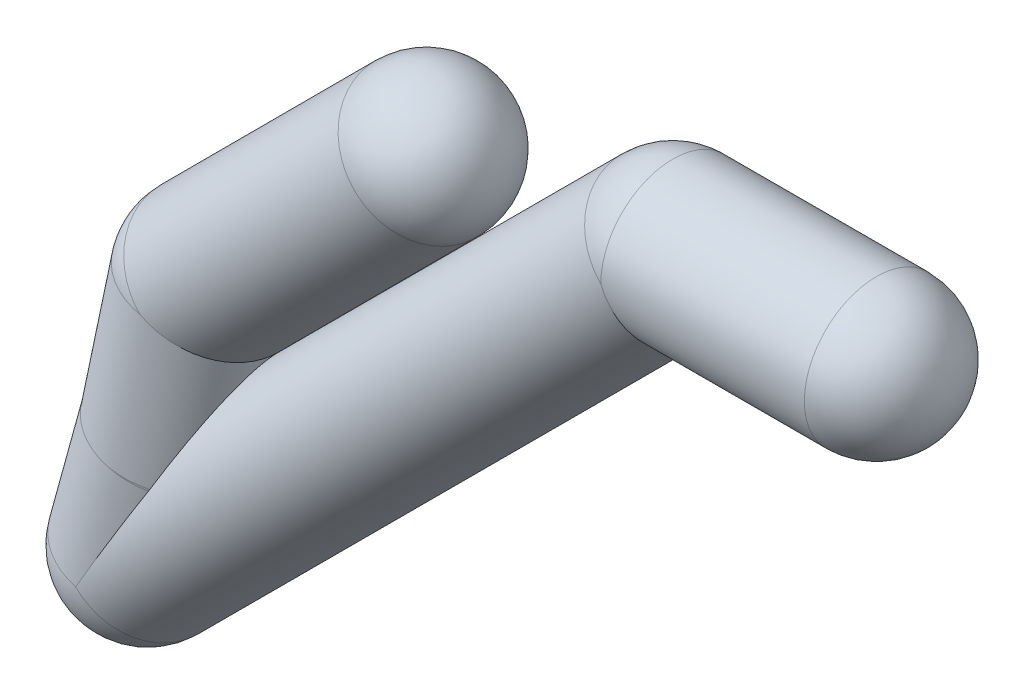
ISO-10303-21;
HEADER;
FILE_DESCRIPTION(('STEP AP214'),'2;1');
FILE_NAME('part.step','',(''),(''),'','','');
FILE_SCHEMA(('AUTOMOTIVE_DESIGN { 1 0 10303 214 1 1 1 1 }'));
ENDSEC;
DATA;
#1=APPLICATION_CONTEXT('core data for automotive mechanical design processes');
#2=APPLICATION_PROTOCOL_DEFINITION('international standard','automotive_design',2000,#1);
#3=PRODUCT_CONTEXT('',#1,'mechanical');
#4=PRODUCT('Part','Part','',(#3));
#5=PRODUCT_RELATED_PRODUCT_CATEGORY('part','',(#4));
#6=PRODUCT_DEFINITION_FORMATION('','',#4);
#7=PRODUCT_DEFINITION_CONTEXT('part definition',#1,'design');
#8=PRODUCT_DEFINITION('design','',#6,#7);
#9=PRODUCT_DEFINITION_SHAPE('','',#8);
#10=(LENGTH_UNIT() NAMED_UNIT(*) SI_UNIT(.MILLI.,.METRE.));
#11=(NAMED_UNIT(*) PLANE_ANGLE_UNIT() SI_UNIT($,.RADIAN.));
#12=(NAMED_UNIT(*) SI_UNIT($,.STERADIAN.) SOLID_ANGLE_UNIT());
#13=UNCERTAINTY_MEASURE_WITH_UNIT(LENGTH_MEASURE(1.E-05),#10,'distance_accuracy_value','');
#14=(GEOMETRIC_REPRESENTATION_CONTEXT(3) GLOBAL_UNCERTAINTY_ASSIGNED_CONTEXT((#13)) GLOBAL_UNIT_ASSIGNED_CONTEXT((#10,
#11,#12)) REPRESENTATION_CONTEXT('',''));
#15=CARTESIAN_POINT('',(0.,0.,0.));
#16=DIRECTION('',(0.,0.,1.));
#17=DIRECTION('',(1.,0.,0.));
#18=AXIS2_PLACEMENT_3D('',#15,#16,#17);
#19=CARTESIAN_POINT('',(13.602,1.351,2.025));
#20=DIRECTION('',(1.,0.,0.));
#21=DIRECTION('',(0.,-1.,0.));
#22=AXIS2_PLACEMENT_3D('',#19,#20,#21);
#23=SPHERICAL_SURFACE('',#22,0.24);
#24=CARTESIAN_POINT('',(13.602,1.351,2.025));
#25=DIRECTION('',(0.706611781871566,0.707601434227129,0.));
#26=DIRECTION('',(-0.707601434227129,0.706611781871566,0.));
#27=AXIS2_PLACEMENT_3D('',#24,#25,#26);
#28=SPHERICAL_SURFACE('',#27,0.24);
#29=CARTESIAN_POINT('',(13.602,1.351,2.025));
#30=DIRECTION('',(0.706611781871566,0.707601434227129,0.));
#31=DIRECTION('',(-0.707601434227129,0.706611781871566,0.));
#32=AXIS2_PLACEMENT_3D('',#29,#30,#31);
#33=CIRCLE('',#32,0.24);
#34=CARTESIAN_POINT('',(13.4321756557855,1.52058682764918,2.025));
#35=VERTEX_POINT('',#34);
#36=EDGE_CURVE('E70',#35,#35,#33,.F.);
#37=ORIENTED_EDGE('',*,*,#36,.F.);
#38=EDGE_LOOP('',(#37));
#39=FACE_BOUND('',#38,.T.);
#40=ADVANCED_FACE('F63',(#39),#28,.T.);
#41=CARTESIAN_POINT('',(12.888,0.636000000000002,2.025));
#42=DIRECTION('',(0.706611781871566,0.707601434227129,0.));
#43=DIRECTION('',(-0.707601434227129,0.706611781871566,0.));
#44=AXIS2_PLACEMENT_3D('',#41,#42,#43);
#45=CYLINDRICAL_SURFACE('',#44,0.24);
#46=CARTESIAN_POINT('',(12.888,0.636000000000002,2.025));
#47=DIRECTION('',(0.476176735595171,0.879349598554481,0.));
#48=DIRECTION('',(0.879349598554481,-0.476176735595172,0.));
#49=AXIS2_PLACEMENT_3D('',#46,#47,#48);
#50=ELLIPSE('',#49,0.250338705987758,0.24);
#51=CARTESIAN_POINT('',(12.888,0.636000000000001,1.785));
#52=VERTEX_POINT('',#51);
#53=CARTESIAN_POINT('',(12.888,0.636,2.265));
#54=VERTEX_POINT('',#53);
#55=EDGE_CURVE('E12',#52,#54,#50,.F.);
#56=ORIENTED_EDGE('',*,*,#55,.F.);
#57=CARTESIAN_POINT('',(12.888,0.636000000000002,2.025));
#58=DIRECTION('',(0.706611781871562,0.707601434227134,0.));
#59=DIRECTION('',(-0.707601434227134,0.706611781871562,0.));
#60=AXIS2_PLACEMENT_3D('',#57,#58,#59);
#61=CIRCLE('',#60,0.24);
#62=EDGE_CURVE('E76',#52,#54,#61,.T.);
#63=ORIENTED_EDGE('',*,*,#62,.T.);
#64=EDGE_LOOP('',(#56,#63));
#65=FACE_BOUND('',#64,.T.);
#66=ORIENTED_EDGE('',*,*,#36,.T.);
#67=EDGE_LOOP('',(#66));
#68=FACE_BOUND('',#67,.T.);
#69=ADVANCED_FACE('F236',(#65,#68),#45,.T.);
#70=CARTESIAN_POINT('',(12.888,0.636,2.025));
#71=DIRECTION('',(1.,0.,0.));
#72=DIRECTION('',(0.,-1.,0.));
#73=AXIS2_PLACEMENT_3D('',#70,#71,#72);
#74=SPHERICAL_SURFACE('',#73,0.24);
#75=ORIENTED_EDGE('',*,*,#62,.F.);
#76=CARTESIAN_POINT('',(12.888,0.636,2.025));
#77=DIRECTION('',(0.206410565926539,0.978465471170999,0.));
#78=DIRECTION('',(-0.978465471170999,0.206410565926539,0.));
#79=AXIS2_PLACEMENT_3D('',#76,#77,#78);
#80=CIRCLE('',#79,0.24);
#81=EDGE_CURVE('E203',#54,#52,#80,.F.);
#82=ORIENTED_EDGE('',*,*,#81,.F.);
#83=EDGE_LOOP('',(#75,#82));
#84=FACE_BOUND('',#83,.T.);
#85=ADVANCED_FACE('F187',(#84),#74,.T.);
#86=CARTESIAN_POINT('',(12.784,0.143,2.025));
#87=DIRECTION('',(0.206410565926539,0.978465471170999,0.));
#88=DIRECTION('',(-0.978465471170999,0.206410565926539,0.));
#89=AXIS2_PLACEMENT_3D('',#86,#87,#88);
#90=CYLINDRICAL_SURFACE('',#89,0.240000000000001);
#91=CARTESIAN_POINT('',(12.7064678663239,-0.22453213367609,2.025));
#92=DIRECTION('',(-0.879182932883338,0.476484386445823,0.));
#93=DIRECTION('',(0.476484386445823,0.879182932883338,0.));
#94=AXIS2_PLACEMENT_3D('',#91,#92,#93);
#95=ELLIPSE('',#94,0.842842016620511,0.24);
#96=CARTESIAN_POINT('',(12.8931747613077,0.119969218709933,1.81251363665738));
#97=VERTEX_POINT('',#96);
#98=CARTESIAN_POINT('',(12.8931747613077,0.119969218709933,2.23748636334262));
#99=VERTEX_POINT('',#98);
#100=EDGE_CURVE('E210',#97,#99,#95,.F.);
#101=ORIENTED_EDGE('',*,*,#100,.F.);
#102=CARTESIAN_POINT('',(12.784,0.143,2.025));
#103=DIRECTION('',(0.206410565926552,0.978465471170997,0.));
#104=DIRECTION('',(-0.978465471170997,0.206410565926552,0.));
#105=AXIS2_PLACEMENT_3D('',#102,#103,#104);
#106=CIRCLE('',#105,0.240000000000001);
#107=CARTESIAN_POINT('',(12.784,0.143,1.785));
#108=VERTEX_POINT('',#107);
#109=EDGE_CURVE('E149',#97,#108,#106,.T.);
#110=ORIENTED_EDGE('',*,*,#109,.T.);
#111=CARTESIAN_POINT('',(12.784,0.143000000000015,1.785));
#112=CARTESIAN_POINT('',(12.7815775992043,0.143588017365079,1.7849999867102));
#113=CARTESIAN_POINT('',(12.7791551215615,0.144175709143954,1.78503880030468));
#114=CARTESIAN_POINT('',(12.7743286824724,0.145345974676489,1.78519346401768));
#115=CARTESIAN_POINT('',(12.7719247062244,0.145928556238124,1.78530879342118));
#116=CARTESIAN_POINT('',(12.7671375286231,0.147088124939416,1.78561483604807));
#117=CARTESIAN_POINT('',(12.7647542969478,0.147665123224102,1.78580503270718));
#118=CARTESIAN_POINT('',(12.7600107778391,0.148813067424557,1.78625907860391));
#119=CARTESIAN_POINT('',(12.7576504448556,0.149384027764726,1.78652241604934));
#120=CARTESIAN_POINT('',(12.7529547603548,0.150519467102333,1.78712097552398));
#121=CARTESIAN_POINT('',(12.7506193486542,0.151083963671921,1.78745569088422));
#122=CARTESIAN_POINT('',(12.7459755747065,0.15220603602769,1.78819515623882));
#123=CARTESIAN_POINT('',(12.743667137126,0.152763632671543,1.78859940536123));
#124=CARTESIAN_POINT('',(12.7368092194806,0.15441965052038,1.78990986031659));
#125=CARTESIAN_POINT('',(12.7322779593825,0.155513188175301,1.7909200710376));
#126=CARTESIAN_POINT('',(12.7233453908211,0.157667970304556,1.79319986043961));
#127=CARTESIAN_POINT('',(12.7189431509314,0.158729452685622,1.79446558528082));
#128=CARTESIAN_POINT('',(12.7102805783545,0.160817613398415,1.79724060506259));
#129=CARTESIAN_POINT('',(12.7060191168198,0.16184457230684,1.79874616180333));
#130=CARTESIAN_POINT('',(12.6976490594485,0.163861369876666,1.80198464296205));
#131=CARTESIAN_POINT('',(12.6935391432164,0.164851530817235,1.80371395571394));
#132=CARTESIAN_POINT('',(12.6854815272655,0.166792759440599,1.80738356723135));
#133=CARTESIAN_POINT('',(12.6815323308024,0.167744187896339,1.80932038908471));
#134=CARTESIAN_POINT('',(12.6738041134214,0.16960627100918,1.81338854826271));
#135=CARTESIAN_POINT('',(12.6700234322947,0.170517322289739,1.81551655079073));
#136=CARTESIAN_POINT('',(12.6626388205113,0.172297262713954,1.81995062641711));
#137=CARTESIAN_POINT('',(12.6590330797298,0.173166581532155,1.82225351290629));
#138=CARTESIAN_POINT('',(12.6520036089745,0.174861945871511,1.82702103401801));
#139=CARTESIAN_POINT('',(12.6485779322727,0.175688451377753,1.82948263517413));
#140=CARTESIAN_POINT('',(12.6419125947434,0.177297342687196,1.8345514757358));
#141=CARTESIAN_POINT('',(12.6386708638027,0.178080216068341,1.83715583867449));
#142=CARTESIAN_POINT('',(12.6323762344137,0.179601247350535,1.84249438604725));
#143=CARTESIAN_POINT('',(12.6293211554634,0.180339917756383,1.84522585383611));
#144=CARTESIAN_POINT('',(12.623401526812,0.181772183472856,1.85080315926469));
#145=CARTESIAN_POINT('',(12.6205346989483,0.182466313610514,1.85364644192347));
#146=CARTESIAN_POINT('',(12.6149922201948,0.183809360388936,1.85943235396692));
#147=CARTESIAN_POINT('',(12.6123142058832,0.18445883164866,1.86237259095841));
#148=CARTESIAN_POINT('',(12.6071490249243,0.185712628289679,1.86833787223179));
#149=CARTESIAN_POINT('',(12.6046594216239,0.186317525636138,1.87136068677338));
#150=CARTESIAN_POINT('',(12.5998698289219,0.187482432772521,1.87747711464001));
#151=CARTESIAN_POINT('',(12.5975673412485,0.188043029521943,1.8805686601461));
#152=CARTESIAN_POINT('',(12.5931499140998,0.189119769184476,1.88680911203428));
#153=CARTESIAN_POINT('',(12.5910324258969,0.189636511801295,1.88995611105254));
#154=CARTESIAN_POINT('',(12.5869821719717,0.190626137138673,1.89629463514812));
#155=CARTESIAN_POINT('',(12.5850468177501,0.191099630165472,1.89948441117735));
#156=CARTESIAN_POINT('',(12.5813573168747,0.192003495534841,1.90589628329114));
#157=CARTESIAN_POINT('',(12.5796005521319,0.192434486758518,1.9091167858917));
#158=CARTESIAN_POINT('',(12.5762640953991,0.193254218379677,1.91557855333979));
#159=CARTESIAN_POINT('',(12.5746817653925,0.193643584323983,1.91881837696314));
#160=CARTESIAN_POINT('',(12.571689490801,0.194381051665756,1.92530789032359));
#161=CARTESIAN_POINT('',(12.5702768974015,0.194729783488663,1.9285562872977));
#162=CARTESIAN_POINT('',(12.5676189213356,0.195387071532903,1.93505272092245));
#163=CARTESIAN_POINT('',(12.566370887645,0.195696261395898,1.93829960903471));
#164=CARTESIAN_POINT('',(12.5640364316077,0.196275643902571,1.94478347120039));
#165=CARTESIAN_POINT('',(12.5629473640714,0.196546471868287,1.94801943631996));
#166=CARTESIAN_POINT('',(12.5609248761871,0.197050385744218,1.95447256989849));
#167=CARTESIAN_POINT('',(12.5599888239832,0.197284107248705,1.95768886407676));
#168=CARTESIAN_POINT('',(12.5582660948732,0.197715128103151,1.96409443859272));
#169=CARTESIAN_POINT('',(12.5574768064031,0.1979130620397,1.96728297406994));
#170=CARTESIAN_POINT('',(12.5560410791287,0.198273880991518,1.97362547000332));
#171=CARTESIAN_POINT('',(12.555392055476,0.198437398434021,1.97677880955195));
#172=CARTESIAN_POINT('',(12.5542301293189,0.198730800218974,1.98304399568515));
#173=CARTESIAN_POINT('',(12.5537146745811,0.198861313805436,1.98615533965868));
#174=CARTESIAN_POINT('',(12.5528130025092,0.199090156214712,1.99233024436968));
#175=CARTESIAN_POINT('',(12.5524242709441,0.199189110201528,1.99539341498664));
#176=CARTESIAN_POINT('',(12.5517690506685,0.199356304875705,2.00146629187923));
#177=CARTESIAN_POINT('',(12.5515000906188,0.199425165876234,2.00447571461712));
#178=CARTESIAN_POINT('',(12.5510773492361,0.19953366044002,2.01043600457291));
#179=CARTESIAN_POINT('',(12.5509211438641,0.199573908820083,2.01338668883146));
#180=CARTESIAN_POINT('',(12.5507168160276,0.199626670426365,2.01922497428175));
#181=CARTESIAN_POINT('',(12.5506663207714,0.199639792449867,2.02211248714088));
#182=CARTESIAN_POINT('',(12.5506663207714,0.199639792449867,2.02788751285912));
#183=CARTESIAN_POINT('',(12.5507168160276,0.199626670426365,2.03077502571825));
#184=CARTESIAN_POINT('',(12.5509211438641,0.199573908820083,2.03661331116854));
#185=CARTESIAN_POINT('',(12.5510773492361,0.19953366044002,2.03956399542709));
#186=CARTESIAN_POINT('',(12.5515000906188,0.199425165876234,2.04552428538288));
#187=CARTESIAN_POINT('',(12.5517690506685,0.199356304875705,2.04853370812077));
#188=CARTESIAN_POINT('',(12.5524242709441,0.199189110201528,2.05460658501336));
#189=CARTESIAN_POINT('',(12.5528130025092,0.199090156214712,2.05766975563032));
#190=CARTESIAN_POINT('',(12.5537146745811,0.198861313805436,2.06384466034132));
#191=CARTESIAN_POINT('',(12.5542301293189,0.198730800218974,2.06695600431485));
#192=CARTESIAN_POINT('',(12.555392055476,0.198437398434021,2.07322119044805));
#193=CARTESIAN_POINT('',(12.5560410791287,0.198273880991518,2.07637452999668));
#194=CARTESIAN_POINT('',(12.5574768064031,0.1979130620397,2.08271702593006));
#195=CARTESIAN_POINT('',(12.5582660948732,0.197715128103151,2.08590556140728));
#196=CARTESIAN_POINT('',(12.5599888239832,0.197284107248705,2.09231113592323));
#197=CARTESIAN_POINT('',(12.5609248761871,0.197050385744218,2.09552743010151));
#198=CARTESIAN_POINT('',(12.5629473640714,0.196546471868287,2.10198056368004));
#199=CARTESIAN_POINT('',(12.5640364316077,0.196275643902571,2.10521652879961));
#200=CARTESIAN_POINT('',(12.566370887645,0.195696261395898,2.11170039096529));
#201=CARTESIAN_POINT('',(12.5676189213356,0.195387071532903,2.11494727907755));
#202=CARTESIAN_POINT('',(12.5702768974015,0.194729783488663,2.1214437127023));
#203=CARTESIAN_POINT('',(12.571689490801,0.194381051665756,2.12469210967641));
#204=CARTESIAN_POINT('',(12.5746817653925,0.193643584323983,2.13118162303686));
#205=CARTESIAN_POINT('',(12.5762640953991,0.193254218379677,2.13442144666021));
#206=CARTESIAN_POINT('',(12.5796005521319,0.192434486758518,2.1408832141083));
#207=CARTESIAN_POINT('',(12.5813573168747,0.192003495534841,2.14410371670886));
#208=CARTESIAN_POINT('',(12.5850468177501,0.191099630165472,2.15051558882265));
#209=CARTESIAN_POINT('',(12.5869821719717,0.190626137138673,2.15370536485188));
#210=CARTESIAN_POINT('',(12.5910324258969,0.189636511801295,2.16004388894746));
#211=CARTESIAN_POINT('',(12.5931499140998,0.189119769184476,2.16319088796572));
#212=CARTESIAN_POINT('',(12.5975673412485,0.188043029521943,2.1694313398539));
#213=CARTESIAN_POINT('',(12.5998698289219,0.187482432772521,2.17252288535999));
#214=CARTESIAN_POINT('',(12.6046594216239,0.186317525636138,2.17863931322662));
#215=CARTESIAN_POINT('',(12.6071490249243,0.185712628289679,2.18166212776821));
#216=CARTESIAN_POINT('',(12.6123142058832,0.18445883164866,2.18762740904159));
#217=CARTESIAN_POINT('',(12.6149922201948,0.183809360388936,2.19056764603308));
#218=CARTESIAN_POINT('',(12.6205346989483,0.182466313610514,2.19635355807653));
#219=CARTESIAN_POINT('',(12.623401526812,0.181772183472856,2.19919684073531));
#220=CARTESIAN_POINT('',(12.6293211554634,0.180339917756383,2.20477414616389));
#221=CARTESIAN_POINT('',(12.6323762344137,0.179601247350535,2.20750561395275));
#222=CARTESIAN_POINT('',(12.6386708638027,0.178080216068341,2.21284416132551));
#223=CARTESIAN_POINT('',(12.6419125947434,0.177297342687196,2.2154485242642));
#224=CARTESIAN_POINT('',(12.6485779322727,0.175688451377753,2.22051736482586));
#225=CARTESIAN_POINT('',(12.6520036089745,0.174861945871511,2.22297896598199));
#226=CARTESIAN_POINT('',(12.6590330797298,0.173166581532156,2.22774648709371));
#227=CARTESIAN_POINT('',(12.6626388205113,0.172297262713954,2.23004937358288));
#228=CARTESIAN_POINT('',(12.6700234322947,0.170517322289739,2.23448344920927));
#229=CARTESIAN_POINT('',(12.6738041134214,0.16960627100918,2.23661145173729));
#230=CARTESIAN_POINT('',(12.6815323308024,0.167744187896339,2.24067961091529));
#231=CARTESIAN_POINT('',(12.6854815272655,0.166792759440599,2.24261643276865));
#232=CARTESIAN_POINT('',(12.6935391432164,0.164851530817235,2.24628604428606));
#233=CARTESIAN_POINT('',(12.6976490594485,0.163861369876666,2.24801535703795));
#234=CARTESIAN_POINT('',(12.7060191168198,0.16184457230684,2.25125383819667));
#235=CARTESIAN_POINT('',(12.7102805783545,0.160817613398415,2.25275939493741));
#236=CARTESIAN_POINT('',(12.7189431509314,0.158729452685622,2.25553441471918));
#237=CARTESIAN_POINT('',(12.7233453908211,0.157667970304556,2.25680013956039));
#238=CARTESIAN_POINT('',(12.7322779593825,0.155513188175301,2.2590799289624));
#239=CARTESIAN_POINT('',(12.7368092194806,0.15441965052038,2.26009013968341));
#240=CARTESIAN_POINT('',(12.743667137126,0.152763632671543,2.26140059463877));
#241=CARTESIAN_POINT('',(12.7459755747065,0.15220603602769,2.26180484376118));
#242=CARTESIAN_POINT('',(12.7506193486542,0.151083963671921,2.26254430911578));
#243=CARTESIAN_POINT('',(12.7529547603548,0.150519467102333,2.26287902447602));
#244=CARTESIAN_POINT('',(12.7576504448556,0.149384027764726,2.26347758395066));
#245=CARTESIAN_POINT('',(12.7600107778391,0.148813067424557,2.26374092139609));
#246=CARTESIAN_POINT('',(12.7647542969478,0.147665123224102,2.26419496729282));
#247=CARTESIAN_POINT('',(12.7671375286231,0.147088124939416,2.26438516395193));
#248=CARTESIAN_POINT('',(12.7719247062244,0.145928556238124,2.26469120657882));
#249=CARTESIAN_POINT('',(12.7743286824724,0.145345974676489,2.26480653598232));
#250=CARTESIAN_POINT('',(12.7791551215615,0.144175709143954,2.26496119969532));
#251=CARTESIAN_POINT('',(12.7815775992043,0.143588017365079,2.2650000132898));
#252=CARTESIAN_POINT('',(12.784,0.143000000000015,2.265));
#253=B_SPLINE_CURVE_WITH_KNOTS('',3,(#111,#112,#113,#114,#115,#116,#117,#118,#119,#120,#121,
#122,#123,#124,#125,#126,#127,#128,#129,#130,#131,#132,#133,#134,#135,#136,#137,#138,#139,#140,
#141,#142,#143,#144,#145,#146,#147,#148,#149,#150,#151,#152,#153,#154,#155,#156,#157,#158,#159,
#160,#161,#162,#163,#164,#165,#166,#167,#168,#169,#170,#171,#172,#173,#174,#175,#176,#177,#178,
#179,#180,#181,#182,#183,#184,#185,#186,#187,#188,#189,#190,#191,#192,#193,#194,#195,#196,#197,
#198,#199,#200,#201,#202,#203,#204,#205,#206,#207,#208,#209,#210,#211,#212,#213,#214,#215,#216,
#217,#218,#219,#220,#221,#222,#223,#224,#225,#226,#227,#228,#229,#230,#231,#232,#233,#234,#235,
#236,#237,#238,#239,#240,#241,#242,#243,#244,#245,#246,#247,#248,#249,#250,#251,#252),
.UNSPECIFIED.,.F.,.F.,(4,2,2,2,2,2,2,2,2,2,2,2,2,2,2,2,2,2,2,2,2,2,2,2,2,2,2,2,2,2,2,2,2,2,2,2,
2,2,2,2,2,2,2,2,2,2,2,2,2,2,2,2,2,2,2,2,2,2,2,2,2,2,2,2,2,2,2,2,2,2,4),(0.,0.00747793575424866,
0.0149054966751709,0.0222826832429827,0.0296094959500324,0.0368859353011254,0.0441120018138552,
0.0584114339444152,0.0725094471879466,0.0864060443277579,0.10010122841435,0.113595002779257,
0.126887371049937,0.139978337165825,0.152867905395604,0.165556080355887,0.178042867031371,
0.190328270796662,0.202412297439904,0.214294953188413,0.225976244736523,0.237456179275868,
0.248734764528354,0.259812008782144,0.270687920930952,0.28136251051705,0.29183578777839,
0.302107763700354,0.312178450072651,0.322047859552023,0.331716005731447,0.341182903216709,
0.350448567711251,0.359513016110435,0.368376266606481,0.377038338805565,0.38570041100465,
0.394563661500696,0.40362810989988,0.412893774394421,0.422360671879684,0.432028818059108,
0.441898227538479,0.451968913910777,0.462240889832741,0.472714167094081,0.483388756680179,
0.494264668828987,0.505341913082777,0.516620498335263,0.528100432874607,0.539781724422718,
0.551664380171227,0.563748406814469,0.576033810579759,0.588520597255244,0.601208772215527,
0.614098340445306,0.627189306561193,0.640481674831873,0.653975449196781,0.667670633283373,
0.681567230423184,0.695665243666716,0.709964675797276,0.717190742310005,0.724467181661098,
0.731793994368148,0.73917118093596,0.746598741856882,0.754076677611131),.UNSPECIFIED.);
#254=CARTESIAN_POINT('',(12.784,0.143,2.265));
#255=VERTEX_POINT('',#254);
#256=EDGE_CURVE('E209',#108,#255,#253,.T.);
#257=ORIENTED_EDGE('',*,*,#256,.T.);
#258=EDGE_CURVE('E195',#255,#99,#106,.T.);
#259=ORIENTED_EDGE('',*,*,#258,.T.);
#260=EDGE_LOOP('',(#101,#110,#257,#259));
#261=FACE_BOUND('',#260,.T.);
#262=ORIENTED_EDGE('',*,*,#81,.T.);
#263=ORIENTED_EDGE('',*,*,#55,.T.);
#264=EDGE_LOOP('',(#262,#263));
#265=FACE_BOUND('',#264,.T.);
#266=ADVANCED_FACE('F174',(#261,#265),#90,.T.);
#267=CARTESIAN_POINT('',(12.784,0.143,2.025));
#268=DIRECTION('',(1.,0.,0.));
#269=DIRECTION('',(0.,-1.,0.));
#270=AXIS2_PLACEMENT_3D('',#267,#268,#269);
#271=SPHERICAL_SURFACE('',#270,0.24);
#272=ORIENTED_EDGE('',*,*,#258,.F.);
#273=CARTESIAN_POINT('',(12.784,0.143,2.025));
#274=DIRECTION('',(0.265156483021044,0.96420539280379,0.));
#275=DIRECTION('',(-0.96420539280379,0.265156483021044,0.));
#276=AXIS2_PLACEMENT_3D('',#273,#274,#275);
#277=CIRCLE('',#276,0.24);
#278=CARTESIAN_POINT('',(12.8897732493171,0.113912356437795,2.23846177344175));
#279=VERTEX_POINT('',#278);
#280=EDGE_CURVE('E131',#279,#255,#277,.F.);
#281=ORIENTED_EDGE('',*,*,#280,.F.);
#282=CARTESIAN_POINT('',(12.5913966894741,-0.000192055556370016,2.025));
#283=CARTESIAN_POINT('',(12.5913973670319,-0.000192326171126051,2.03571237846248));
#284=CARTESIAN_POINT('',(12.5923468428978,-0.000263494507859086,2.04643302920336));
#285=CARTESIAN_POINT('',(12.5961014955299,-0.000523423352293066,2.06754978465066));
#286=CARTESIAN_POINT('',(12.5989089600891,-0.000712328816262302,2.07794547267417));
#287=CARTESIAN_POINT('',(12.6062360154838,-0.00113312089180266,2.09807527794345));
#288=CARTESIAN_POINT('',(12.6107504299437,-0.00136487648395107,2.10781129144423));
#289=CARTESIAN_POINT('',(12.6212939028173,-0.00175918315959605,2.12641972616711));
#290=CARTESIAN_POINT('',(12.6273228823054,-0.0019217378480388,2.13529219235619));
#291=CARTESIAN_POINT('',(12.6408955117016,-0.00203738726216791,2.15231007242656));
#292=CARTESIAN_POINT('',(12.6484852124569,-0.00198286608125914,2.16041864649109));
#293=CARTESIAN_POINT('',(12.6647513777577,-0.00146505252272552,2.17544059794447));
#294=CARTESIAN_POINT('',(12.6734281688024,-0.00100163708313103,2.18235361476585));
#295=CARTESIAN_POINT('',(12.6926617921763,0.000626760554187505,2.19570657167648));
#296=CARTESIAN_POINT('',(12.7033194506562,0.00186875158588849,2.20199201635485));
#297=CARTESIAN_POINT('',(12.7252264370132,0.00542027346509247,2.21307338029515));
#298=CARTESIAN_POINT('',(12.7364763860188,0.00773094561535479,2.21786769792351));
#299=CARTESIAN_POINT('',(12.7601172971451,0.0139984716110324,2.22642072254851));
#300=CARTESIAN_POINT('',(12.7725218468813,0.0180818528256499,2.23005183891857));
#301=CARTESIAN_POINT('',(12.79684929658,0.0282445224445834,2.23582635771485));
#302=CARTESIAN_POINT('',(12.8087728353657,0.0343210587249353,2.23797179890582));
#303=CARTESIAN_POINT('',(12.8304236738879,0.0480030425618428,2.24080392501552));
#304=CARTESIAN_POINT('',(12.8402520075202,0.0554237367175805,2.24160367107464));
#305=CARTESIAN_POINT('',(12.8584259105931,0.0719285833740034,2.24216377321766));
#306=CARTESIAN_POINT('',(12.8667726079325,0.0810114597439731,2.24192492349719));
#307=CARTESIAN_POINT('',(12.8806606097083,0.0990770412750315,2.24049769952088));
#308=CARTESIAN_POINT('',(12.8864307638367,0.107897340886732,2.23944627511204));
#309=CARTESIAN_POINT('',(12.8966621061823,0.126135057750683,2.23650492594987));
#310=CARTESIAN_POINT('',(12.9011227968542,0.135552700321539,2.23461468316155));
#311=CARTESIAN_POINT('',(12.9091113426739,0.15532017887113,2.22975162171226));
#312=CARTESIAN_POINT('',(12.9125509274018,0.165688841250447,2.2267117017059));
#313=CARTESIAN_POINT('',(12.9182605082565,0.186347439391395,2.21948188619021));
#314=CARTESIAN_POINT('',(12.9205298349771,0.196637326784813,2.21529133459671));
#315=CARTESIAN_POINT('',(12.9244181452586,0.218391113916081,2.20491754713827));
#316=CARTESIAN_POINT('',(12.925878168367,0.229784306589053,2.19852429830336));
#317=CARTESIAN_POINT('',(12.9279044170005,0.251516969583943,2.1840200230656));
#318=CARTESIAN_POINT('',(12.928470382022,0.261856131970368,2.1759084967853));
#319=CARTESIAN_POINT('',(12.9290446692229,0.2810864538431,2.15792518052065));
#320=CARTESIAN_POINT('',(12.9290477415121,0.289963209756885,2.1480376795598));
#321=CARTESIAN_POINT('',(12.9287890261659,0.305660277466619,2.1267465419788));
#322=CARTESIAN_POINT('',(12.9285274729393,0.312482402339477,2.11534425494025));
#323=CARTESIAN_POINT('',(12.9280218657644,0.322985127523146,2.09281440776288));
#324=CARTESIAN_POINT('',(12.9277794428103,0.326943284452368,2.08181614344016));
#325=CARTESIAN_POINT('',(12.9274028330981,0.332726913120517,2.05927131756558));
#326=CARTESIAN_POINT('',(12.927268572214,0.334553845822022,2.04772513726925));
#327=CARTESIAN_POINT('',(12.9271702087126,0.335903271951204,2.02566004478844));
#328=CARTESIAN_POINT('',(12.9271904591773,0.335637584121629,2.01515363275663));
#329=CARTESIAN_POINT('',(12.927357096718,0.333311626941828,1.9943445095256));
#330=CARTESIAN_POINT('',(12.9275034569148,0.331251740009527,1.984041755397));
#331=CARTESIAN_POINT('',(12.9278666605288,0.325489173810259,1.96412686825175));
#332=CARTESIAN_POINT('',(12.9280820929051,0.321818881684343,1.95450525858078));
#333=CARTESIAN_POINT('',(12.9284979173991,0.312997767988076,1.93596880990179));
#334=CARTESIAN_POINT('',(12.9286983069699,0.307846696422095,1.92705409056048));
#335=CARTESIAN_POINT('',(12.9289769021728,0.295930143682848,1.90962340739549));
#336=CARTESIAN_POINT('',(12.9290475275424,0.289089627314341,1.90115879267081));
#337=CARTESIAN_POINT('',(12.9288824356445,0.274233426833388,1.88534065655729));
#338=CARTESIAN_POINT('',(12.9286466234813,0.266217379371715,1.87798748013921));
#339=CARTESIAN_POINT('',(12.9276345090057,0.248344971182602,1.86370316756848));
#340=CARTESIAN_POINT('',(12.926801450637,0.238383146547366,1.8569080791316));
#341=CARTESIAN_POINT('',(12.9242642589401,0.21771442048314,1.84475211201268));
#342=CARTESIAN_POINT('',(12.9225592363603,0.207006768088013,1.83939270599579));
#343=CARTESIAN_POINT('',(12.9177453266229,0.184067302348825,1.82954124254902));
#344=CARTESIAN_POINT('',(12.9145050388709,0.171795524026532,1.82520472765227));
#345=CARTESIAN_POINT('',(12.9062222715089,0.147414855636203,1.8180693474403));
#346=CARTESIAN_POINT('',(12.9011818814968,0.135305793524817,1.81526870876459));
#347=CARTESIAN_POINT('',(12.890206376664,0.114176193152026,1.81144566678119));
#348=CARTESIAN_POINT('',(12.8846329723931,0.105011336209103,1.81018407186683));
#349=CARTESIAN_POINT('',(12.8721234430671,0.0875827693897904,1.80848501704839));
#350=CARTESIAN_POINT('',(12.865188634747,0.0793182006799028,1.80804676511118));
#351=CARTESIAN_POINT('',(12.8500877315074,0.0639761751900249,1.80796616472503));
#352=CARTESIAN_POINT('',(12.8419199648033,0.0569003582072445,1.80832490613046));
#353=CARTESIAN_POINT('',(12.8246494721183,0.0441077361275026,1.80986256391283));
#354=CARTESIAN_POINT('',(12.8155461777541,0.03839176428314,1.81104198143547));
#355=CARTESIAN_POINT('',(12.7968208887362,0.0283448803094528,1.81427561113566));
#356=CARTESIAN_POINT('',(12.7872018544203,0.0240068838313736,1.81632521799539));
#357=CARTESIAN_POINT('',(12.7677491009705,0.016547209205481,1.82138116174072));
#358=CARTESIAN_POINT('',(12.7579153000907,0.0134260030317599,1.82438786905096));
#359=CARTESIAN_POINT('',(12.7368475776816,0.00781670210067163,1.83198468118077));
#360=CARTESIAN_POINT('',(12.7256300775178,0.00549897189487517,1.83674684283436));
#361=CARTESIAN_POINT('',(12.7037643539804,0.00192811738988901,1.84775947720303));
#362=CARTESIAN_POINT('',(12.6931164942922,0.000675665789616184,1.85401088715985));
#363=CARTESIAN_POINT('',(12.6718878294985,-0.00114291952418501,1.86868116987613));
#364=CARTESIAN_POINT('',(12.6613996812178,-0.00163696788227972,1.87724467407475));
#365=CARTESIAN_POINT('',(12.6421250487764,-0.00207585357925917,1.89613408131423));
#366=CARTESIAN_POINT('',(12.6333381566929,-0.00202082274158268,1.90645956075337));
#367=CARTESIAN_POINT('',(12.6186001928141,-0.00169297294658579,1.92773466145901));
#368=CARTESIAN_POINT('',(12.6124760784721,-0.00143831582923628,1.93856435640513));
#369=CARTESIAN_POINT('',(12.6024396173884,-0.000933717530464052,1.961192350239));
#370=CARTESIAN_POINT('',(12.5985221830969,-0.000683766796206425,1.97298834870993));
#371=CARTESIAN_POINT('',(12.5943557574927,-0.000403865385272673,1.99159757555792));
#372=CARTESIAN_POINT('',(12.593248497374,-0.00032557137511823,1.99822802483228));
#373=CARTESIAN_POINT('',(12.5917687675121,-0.000219582770248582,2.01157123473739));
#374=CARTESIAN_POINT('',(12.5913962646866,-0.000191885897412585,2.01828399164855));
#375=CARTESIAN_POINT('',(12.5913966894741,-0.000192055556370016,2.025));
#376=B_SPLINE_CURVE_WITH_KNOTS('',3,(#282,#283,#284,#285,#286,#287,#288,#289,#290,#291,#292,
#293,#294,#295,#296,#297,#298,#299,#300,#301,#302,#303,#304,#305,#306,#307,#308,#309,#310,#311,
#312,#313,#314,#315,#316,#317,#318,#319,#320,#321,#322,#323,#324,#325,#326,#327,#328,#329,#330,
#331,#332,#333,#334,#335,#336,#337,#338,#339,#340,#341,#342,#343,#344,#345,#346,#347,#348,#349,
#350,#351,#352,#353,#354,#355,#356,#357,#358,#359,#360,#361,#362,#363,#364,#365,#366,#367,#368,
#369,#370,#371,#372,#373,#374,#375),.UNSPECIFIED.,.T.,.F.,(4,2,2,2,2,2,2,2,2,2,2,2,2,2,2,2,2,2,
2,2,2,2,2,2,2,2,2,2,2,2,2,2,2,2,2,2,2,2,2,2,2,2,2,2,2,2,4),(0.,0.0321101596990286,
0.0642599312753661,0.0963129796494902,0.128364358050354,0.161549966058435,0.194745565108732,
0.231896202753241,0.269086607527345,0.309536491617241,0.349930756482988,0.386721455579434,
0.423484026435418,0.455123895195647,0.486775770362381,0.520665883105683,0.554575360088977,
0.593831487606985,0.633099051152954,0.672732830130456,0.712331531730513,0.747209545176346,
0.782063635531169,0.813438712215403,0.844807103211033,0.875571651372893,0.906341396476148,
0.938857527746265,0.971383730813955,1.0074981670499,1.04364950738701,1.08369369949664,
1.12369155772388,1.1559518301142,1.18818105309405,1.22045437528399,1.25274742248609,
1.28487165417613,1.31700833398914,1.35407070677147,1.39115646624986,1.43158693379395,
1.47200769498777,1.50912586150723,1.54615809728797,1.56629011669033,1.58642122963226),.UNSPECIFIED.);
#377=EDGE_CURVE('E128',#279,#99,#376,.T.);
#378=ORIENTED_EDGE('',*,*,#377,.T.);
#379=EDGE_LOOP('',(#272,#281,#378));
#380=FACE_BOUND('',#379,.T.);
#381=ADVANCED_FACE('F170',(#380),#271,.T.);
#382=ORIENTED_EDGE('',*,*,#109,.F.);
#383=CARTESIAN_POINT('',(12.8897732493172,0.113912356437758,1.8115382265582));
#384=VERTEX_POINT('',#383);
#385=EDGE_CURVE('E134',#97,#384,#376,.T.);
#386=ORIENTED_EDGE('',*,*,#385,.T.);
#387=EDGE_CURVE('E127',#108,#384,#277,.F.);
#388=ORIENTED_EDGE('',*,*,#387,.F.);
#389=EDGE_LOOP('',(#382,#386,#388));
#390=FACE_BOUND('',#389,.T.);
#391=ADVANCED_FACE('F173',(#390),#271,.T.);
#392=CARTESIAN_POINT('',(12.674,-0.257,2.025));
#393=DIRECTION('',(1.,0.,0.));
#394=DIRECTION('',(0.,-1.,0.));
#395=AXIS2_PLACEMENT_3D('',#392,#393,#394);
#396=SPHERICAL_SURFACE('',#395,0.24);
#397=CARTESIAN_POINT('',(12.674,-0.257,2.025));
#398=DIRECTION('',(0.265156483021048,0.964205392803789,0.));
#399=DIRECTION('',(-0.964205392803789,0.265156483021048,0.));
#400=AXIS2_PLACEMENT_3D('',#397,#398,#399);
#401=CIRCLE('',#400,0.240000000000001);
#402=CARTESIAN_POINT('',(12.674,-0.257000000000007,1.785));
#403=VERTEX_POINT('',#402);
#404=CARTESIAN_POINT('',(12.674,-0.257000000000007,2.265));
#405=VERTEX_POINT('',#404);
#406=EDGE_CURVE('E222',#403,#405,#401,.T.);
#407=ORIENTED_EDGE('',*,*,#406,.F.);
#408=CARTESIAN_POINT('',(12.674,-0.257,2.025));
#409=DIRECTION('',(-0.707106781186548,-0.707106781186547,0.));
#410=DIRECTION('',(0.707106781186547,-0.707106781186548,0.));
#411=AXIS2_PLACEMENT_3D('',#408,#409,#410);
#412=CIRCLE('',#411,0.24);
#413=EDGE_CURVE('E118',#405,#403,#412,.F.);
#414=ORIENTED_EDGE('',*,*,#413,.F.);
#415=EDGE_LOOP('',(#407,#414));
#416=FACE_BOUND('',#415,.T.);
#417=ADVANCED_FACE('F179',(#416),#396,.T.);
#418=CARTESIAN_POINT('',(14.423,1.492,2.025));
#419=DIRECTION('',(-0.707106781186548,-0.707106781186547,0.));
#420=DIRECTION('',(0.707106781186547,-0.707106781186548,0.));
#421=AXIS2_PLACEMENT_3D('',#418,#419,#420);
#422=CYLINDRICAL_SURFACE('',#421,0.24);
#423=ORIENTED_EDGE('',*,*,#385,.F.);
#424=ORIENTED_EDGE('',*,*,#100,.T.);
#425=ORIENTED_EDGE('',*,*,#377,.F.);
#426=CARTESIAN_POINT('',(12.674,-0.257000000000002,2.025));
#427=DIRECTION('',(-0.86437903274213,0.502840817511645,0.));
#428=DIRECTION('',(-0.502840817511644,-0.864379032742131,0.));
#429=AXIS2_PLACEMENT_3D('',#426,#427,#428);
#430=ELLIPSE('',#429,0.938797727795284,0.24);
#431=EDGE_CURVE('E220',#405,#279,#430,.T.);
#432=ORIENTED_EDGE('',*,*,#431,.F.);
#433=ORIENTED_EDGE('',*,*,#413,.T.);
#434=EDGE_CURVE('E225',#384,#403,#430,.T.);
#435=ORIENTED_EDGE('',*,*,#434,.F.);
#436=EDGE_LOOP('',(#423,#424,#425,#432,#433,#435));
#437=FACE_BOUND('',#436,.T.);
#438=CARTESIAN_POINT('',(14.423,1.492,2.025));
#439=DIRECTION('',(-0.923879532511287,-0.38268343236509,0.));
#440=DIRECTION('',(0.38268343236509,-0.923879532511287,0.));
#441=AXIS2_PLACEMENT_3D('',#438,#439,#440);
#442=ELLIPSE('',#441,0.259774128070175,0.24);
#443=CARTESIAN_POINT('',(14.423,1.492,2.265));
#444=VERTEX_POINT('',#443);
#445=CARTESIAN_POINT('',(14.423,1.492,1.785));
#446=VERTEX_POINT('',#445);
#447=EDGE_CURVE('E123',#444,#446,#442,.F.);
#448=ORIENTED_EDGE('',*,*,#447,.F.);
#449=CARTESIAN_POINT('',(14.423,1.492,2.025));
#450=DIRECTION('',(-0.707106781186548,-0.707106781186547,0.));
#451=DIRECTION('',(0.707106781186547,-0.707106781186548,0.));
#452=AXIS2_PLACEMENT_3D('',#449,#450,#451);
#453=CIRCLE('',#452,0.24);
#454=EDGE_CURVE('E111',#444,#446,#453,.T.);
#455=ORIENTED_EDGE('',*,*,#454,.T.);
#456=EDGE_LOOP('',(#448,#455));
#457=FACE_BOUND('',#456,.T.);
#458=ADVANCED_FACE('F126',(#437,#457),#422,.T.);
#459=CARTESIAN_POINT('',(14.423,1.492,2.025));
#460=DIRECTION('',(1.,0.,0.));
#461=DIRECTION('',(0.,-1.,0.));
#462=AXIS2_PLACEMENT_3D('',#459,#460,#461);
#463=SPHERICAL_SURFACE('',#462,0.24);
#464=ORIENTED_EDGE('',*,*,#454,.F.);
#465=CARTESIAN_POINT('',(14.423,1.492,2.025));
#466=DIRECTION('',(-1.,0.,0.));
#467=DIRECTION('',(0.,0.,1.));
#468=AXIS2_PLACEMENT_3D('',#465,#466,#467);
#469=CIRCLE('',#468,0.24);
#470=EDGE_CURVE('E114',#444,#446,#469,.T.);
#471=ORIENTED_EDGE('',*,*,#470,.T.);
#472=EDGE_LOOP('',(#464,#471));
#473=FACE_BOUND('',#472,.T.);
#474=ADVANCED_FACE('F113',(#473),#463,.T.);
#475=CARTESIAN_POINT('',(15.101,1.492,2.025));
#476=DIRECTION('',(-1.,0.,0.));
#477=DIRECTION('',(0.,0.,1.));
#478=AXIS2_PLACEMENT_3D('',#475,#476,#477);
#479=CYLINDRICAL_SURFACE('',#478,0.24);
#480=ORIENTED_EDGE('',*,*,#470,.F.);
#481=ORIENTED_EDGE('',*,*,#447,.T.);
#482=EDGE_LOOP('',(#480,#481));
#483=FACE_BOUND('',#482,.T.);
#484=CARTESIAN_POINT('',(15.101,1.492,2.025));
#485=DIRECTION('',(-1.,0.,0.));
#486=DIRECTION('',(0.,0.,1.));
#487=AXIS2_PLACEMENT_3D('',#484,#485,#486);
#488=CIRCLE('',#487,0.24);
#489=CARTESIAN_POINT('',(15.101,1.492,2.265));
#490=VERTEX_POINT('',#489);
#491=EDGE_CURVE('E124',#490,#490,#488,.T.);
#492=ORIENTED_EDGE('',*,*,#491,.T.);
#493=EDGE_LOOP('',(#492));
#494=FACE_BOUND('',#493,.T.);
#495=ADVANCED_FACE('F121',(#483,#494),#479,.T.);
#496=CARTESIAN_POINT('',(15.101,1.492,2.025));
#497=DIRECTION('',(1.,0.,0.));
#498=DIRECTION('',(0.,-1.,0.));
#499=AXIS2_PLACEMENT_3D('',#496,#497,#498);
#500=SPHERICAL_SURFACE('',#499,0.24);
#501=ORIENTED_EDGE('',*,*,#491,.F.);
#502=EDGE_LOOP('',(#501));
#503=FACE_BOUND('',#502,.T.);
#504=ADVANCED_FACE('F162',(#503),#500,.T.);
#505=CARTESIAN_POINT('',(12.674,-0.257,2.025));
#506=DIRECTION('',(0.265156483021044,0.96420539280379,0.));
#507=DIRECTION('',(-0.96420539280379,0.265156483021044,0.));
#508=AXIS2_PLACEMENT_3D('',#505,#506,#507);
#509=CYLINDRICAL_SURFACE('',#508,0.240000000000001);
#510=ORIENTED_EDGE('',*,*,#280,.T.);
#511=ORIENTED_EDGE('',*,*,#256,.F.);
#512=ORIENTED_EDGE('',*,*,#387,.T.);
#513=ORIENTED_EDGE('',*,*,#434,.T.);
#514=ORIENTED_EDGE('',*,*,#406,.T.);
#515=ORIENTED_EDGE('',*,*,#431,.T.);
#516=EDGE_LOOP('',(#510,#511,#512,#513,#514,#515));
#517=FACE_BOUND('',#516,.T.);
#518=ADVANCED_FACE('F153',(#517),#509,.T.);
#519=CLOSED_SHELL('',(#40,#69,#85,#266,#381,#391,#417,#458,#474,#495,#504,#518));
#520=MANIFOLD_SOLID_BREP('B2',#519);
#521=ADVANCED_BREP_SHAPE_REPRESENTATION('',(#18,#520),#14);
#522=SHAPE_DEFINITION_REPRESENTATION(#9,#521);
ENDSEC;
END-ISO-10303-21;
